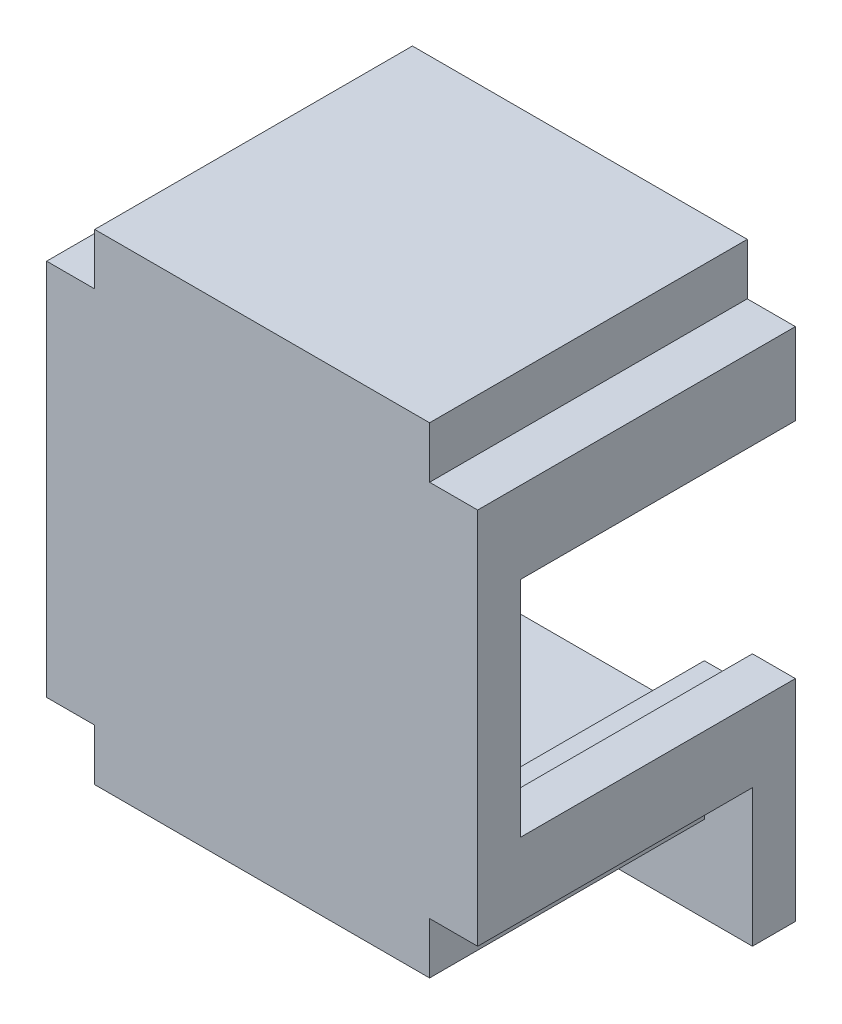
ISO-10303-21;
HEADER;
FILE_DESCRIPTION(('STEP AP214'),'2;1');
FILE_NAME('part.step','',(''),(''),'','','');
FILE_SCHEMA(('AUTOMOTIVE_DESIGN { 1 0 10303 214 1 1 1 1 }'));
ENDSEC;
DATA;
#1=APPLICATION_CONTEXT('core data for automotive mechanical design processes');
#2=APPLICATION_PROTOCOL_DEFINITION('international standard','automotive_design',2000,#1);
#3=PRODUCT_CONTEXT('',#1,'mechanical');
#4=PRODUCT('Part','Part','',(#3));
#5=PRODUCT_RELATED_PRODUCT_CATEGORY('part','',(#4));
#6=PRODUCT_DEFINITION_FORMATION('','',#4);
#7=PRODUCT_DEFINITION_CONTEXT('part definition',#1,'design');
#8=PRODUCT_DEFINITION('design','',#6,#7);
#9=PRODUCT_DEFINITION_SHAPE('','',#8);
#10=(LENGTH_UNIT() NAMED_UNIT(*) SI_UNIT(.MILLI.,.METRE.));
#11=(NAMED_UNIT(*) PLANE_ANGLE_UNIT() SI_UNIT($,.RADIAN.));
#12=(NAMED_UNIT(*) SI_UNIT($,.STERADIAN.) SOLID_ANGLE_UNIT());
#13=UNCERTAINTY_MEASURE_WITH_UNIT(LENGTH_MEASURE(1.E-05),#10,'distance_accuracy_value','');
#14=(GEOMETRIC_REPRESENTATION_CONTEXT(3) GLOBAL_UNCERTAINTY_ASSIGNED_CONTEXT((#13)) GLOBAL_UNIT_ASSIGNED_CONTEXT((#10,
#11,#12)) REPRESENTATION_CONTEXT('',''));
#15=CARTESIAN_POINT('',(0.,0.,0.));
#16=DIRECTION('',(0.,0.,1.));
#17=DIRECTION('',(1.,0.,0.));
#18=AXIS2_PLACEMENT_3D('',#15,#16,#17);
#19=CARTESIAN_POINT('',(0.,0.,32.));
#20=DIRECTION('',(0.,0.,1.));
#21=DIRECTION('',(1.,0.,0.));
#22=AXIS2_PLACEMENT_3D('',#19,#20,#21);
#23=PLANE('',#22);
#24=DIRECTION('',(-1.,0.,0.));
#25=VECTOR('',#24,1.);
#26=CARTESIAN_POINT('',(-10.353949142734,-76.2659169660727,32.));
#27=LINE('',#26,#25);
#28=CARTESIAN_POINT('',(-10.353949142734,-76.2659169660727,32.));
#29=VERTEX_POINT('',#28);
#30=CARTESIAN_POINT('',(-15.353949142734,-76.2659169660727,32.));
#31=VERTEX_POINT('',#30);
#32=EDGE_CURVE('E475',#29,#31,#27,.T.);
#33=ORIENTED_EDGE('',*,*,#32,.T.);
#34=DIRECTION('',(0.,-1.,0.));
#35=VECTOR('',#34,1.);
#36=CARTESIAN_POINT('',(-15.353949142734,-40.765916966074,32.));
#37=LINE('',#36,#35);
#38=CARTESIAN_POINT('',(-15.353949142734,-50.2659169660758,32.));
#39=VERTEX_POINT('',#38);
#40=EDGE_CURVE('E255',#39,#31,#37,.T.);
#41=ORIENTED_EDGE('',*,*,#40,.F.);
#42=DIRECTION('',(-1.,0.,0.));
#43=VECTOR('',#42,1.);
#44=CARTESIAN_POINT('',(-10.3539491427349,-50.2659169660758,32.));
#45=LINE('',#44,#43);
#46=CARTESIAN_POINT('',(-10.3539491427349,-50.2659169660758,32.));
#47=VERTEX_POINT('',#46);
#48=EDGE_CURVE('E282',#47,#39,#45,.T.);
#49=ORIENTED_EDGE('',*,*,#48,.F.);
#50=DIRECTION('',(-2.11250769963314E-13,-1.,0.));
#51=VECTOR('',#50,1.);
#52=CARTESIAN_POINT('',(-10.353949142734,-45.765916966074,32.));
#53=LINE('',#52,#51);
#54=CARTESIAN_POINT('',(-10.353949142734,-45.765916966074,32.));
#55=VERTEX_POINT('',#54);
#56=EDGE_CURVE('E279',#55,#47,#53,.T.);
#57=ORIENTED_EDGE('',*,*,#56,.F.);
#58=DIRECTION('',(-1.,0.,0.));
#59=VECTOR('',#58,1.);
#60=CARTESIAN_POINT('',(-4.753949142734,-45.765916966074,32.));
#61=LINE('',#60,#59);
#62=CARTESIAN_POINT('',(-4.753949142734,-45.765916966074,32.));
#63=VERTEX_POINT('',#62);
#64=EDGE_CURVE('E276',#63,#55,#61,.T.);
#65=ORIENTED_EDGE('',*,*,#64,.F.);
#66=DIRECTION('',(0.,-1.,0.));
#67=VECTOR('',#66,1.);
#68=CARTESIAN_POINT('',(-4.753949142734,-39.765916966074,32.));
#69=LINE('',#68,#67);
#70=CARTESIAN_POINT('',(-4.753949142734,-39.765916966074,32.));
#71=VERTEX_POINT('',#70);
#72=EDGE_CURVE('E51',#71,#63,#69,.T.);
#73=ORIENTED_EDGE('',*,*,#72,.F.);
#74=DIRECTION('',(-1.,0.,0.));
#75=VECTOR('',#74,1.);
#76=CARTESIAN_POINT('',(24.246050857266,-39.765916966074,32.));
#77=LINE('',#76,#75);
#78=CARTESIAN_POINT('',(24.246050857266,-39.765916966074,32.));
#79=VERTEX_POINT('',#78);
#80=EDGE_CURVE('E131',#79,#71,#77,.T.);
#81=ORIENTED_EDGE('',*,*,#80,.F.);
#82=DIRECTION('',(0.,1.,0.));
#83=VECTOR('',#82,1.);
#84=CARTESIAN_POINT('',(24.246050857266,-45.765916966074,32.));
#85=LINE('',#84,#83);
#86=CARTESIAN_POINT('',(24.246050857266,-45.765916966074,32.));
#87=VERTEX_POINT('',#86);
#88=EDGE_CURVE('E128',#87,#79,#85,.T.);
#89=ORIENTED_EDGE('',*,*,#88,.F.);
#90=DIRECTION('',(-1.,0.,0.));
#91=VECTOR('',#90,1.);
#92=CARTESIAN_POINT('',(29.8460508572678,-45.765916966074,32.));
#93=LINE('',#92,#91);
#94=CARTESIAN_POINT('',(29.8460508572678,-45.765916966074,32.));
#95=VERTEX_POINT('',#94);
#96=EDGE_CURVE('E169',#95,#87,#93,.T.);
#97=ORIENTED_EDGE('',*,*,#96,.F.);
#98=DIRECTION('',(0.,1.,0.));
#99=VECTOR('',#98,1.);
#100=CARTESIAN_POINT('',(29.8460508572678,-50.2659169660766,32.));
#101=LINE('',#100,#99);
#102=CARTESIAN_POINT('',(29.8460508572678,-50.2659169660766,32.));
#103=VERTEX_POINT('',#102);
#104=EDGE_CURVE('E110',#103,#95,#101,.T.);
#105=ORIENTED_EDGE('',*,*,#104,.F.);
#106=DIRECTION('',(1.,0.,0.));
#107=VECTOR('',#106,1.);
#108=CARTESIAN_POINT('',(29.8460508572678,-50.2659169660766,32.));
#109=LINE('',#108,#107);
#110=CARTESIAN_POINT('',(34.8460508572677,-50.2659169660766,32.));
#111=VERTEX_POINT('',#110);
#112=EDGE_CURVE('E175',#103,#111,#109,.T.);
#113=ORIENTED_EDGE('',*,*,#112,.T.);
#114=DIRECTION('',(0.,1.,0.));
#115=VECTOR('',#114,1.);
#116=CARTESIAN_POINT('',(34.8460508572673,-84.765916966074,32.));
#117=LINE('',#116,#115);
#118=CARTESIAN_POINT('',(34.8460508572673,-76.2659169660716,32.));
#119=VERTEX_POINT('',#118);
#120=EDGE_CURVE('E222',#119,#111,#117,.T.);
#121=ORIENTED_EDGE('',*,*,#120,.F.);
#122=DIRECTION('',(-1.,0.,0.));
#123=VECTOR('',#122,1.);
#124=CARTESIAN_POINT('',(34.8460508572673,-76.2659169660716,32.));
#125=LINE('',#124,#123);
#126=CARTESIAN_POINT('',(29.8460508572673,-76.2659169660716,32.));
#127=VERTEX_POINT('',#126);
#128=EDGE_CURVE('E477',#119,#127,#125,.T.);
#129=ORIENTED_EDGE('',*,*,#128,.T.);
#130=DIRECTION('',(0.,-1.,0.));
#131=VECTOR('',#130,1.);
#132=CARTESIAN_POINT('',(29.8460508572673,-76.2659169660716,32.));
#133=LINE('',#132,#131);
#134=CARTESIAN_POINT('',(29.8460508572673,-79.765916966074,32.));
#135=VERTEX_POINT('',#134);
#136=EDGE_CURVE('E479',#127,#135,#133,.T.);
#137=ORIENTED_EDGE('',*,*,#136,.T.);
#138=DIRECTION('',(-1.,0.,0.));
#139=VECTOR('',#138,1.);
#140=CARTESIAN_POINT('',(29.8460508572673,-79.765916966074,32.));
#141=LINE('',#140,#139);
#142=CARTESIAN_POINT('',(24.246050857266,-79.765916966074,32.));
#143=VERTEX_POINT('',#142);
#144=EDGE_CURVE('E482',#135,#143,#141,.T.);
#145=ORIENTED_EDGE('',*,*,#144,.T.);
#146=DIRECTION('',(0.,-1.,0.));
#147=VECTOR('',#146,1.);
#148=CARTESIAN_POINT('',(24.246050857266,-79.765916966074,32.));
#149=LINE('',#148,#147);
#150=CARTESIAN_POINT('',(24.246050857266,-85.765916966074,32.));
#151=VERTEX_POINT('',#150);
#152=EDGE_CURVE('E485',#143,#151,#149,.T.);
#153=ORIENTED_EDGE('',*,*,#152,.T.);
#154=DIRECTION('',(-1.,0.,0.));
#155=VECTOR('',#154,1.);
#156=CARTESIAN_POINT('',(24.246050857266,-85.765916966074,32.));
#157=LINE('',#156,#155);
#158=CARTESIAN_POINT('',(-4.753949142734,-85.765916966074,32.));
#159=VERTEX_POINT('',#158);
#160=EDGE_CURVE('E462',#151,#159,#157,.T.);
#161=ORIENTED_EDGE('',*,*,#160,.T.);
#162=DIRECTION('',(0.,1.,0.));
#163=VECTOR('',#162,1.);
#164=CARTESIAN_POINT('',(-4.753949142734,-85.765916966074,32.));
#165=LINE('',#164,#163);
#166=CARTESIAN_POINT('',(-4.753949142734,-79.765916966074,32.));
#167=VERTEX_POINT('',#166);
#168=EDGE_CURVE('E466',#159,#167,#165,.T.);
#169=ORIENTED_EDGE('',*,*,#168,.T.);
#170=DIRECTION('',(-1.,0.,0.));
#171=VECTOR('',#170,1.);
#172=CARTESIAN_POINT('',(-4.753949142734,-79.765916966074,32.));
#173=LINE('',#172,#171);
#174=CARTESIAN_POINT('',(-10.353949142734,-79.765916966074,32.));
#175=VERTEX_POINT('',#174);
#176=EDGE_CURVE('E469',#167,#175,#173,.T.);
#177=ORIENTED_EDGE('',*,*,#176,.T.);
#178=DIRECTION('',(0.,1.,0.));
#179=VECTOR('',#178,1.);
#180=CARTESIAN_POINT('',(-10.353949142734,-79.765916966074,32.));
#181=LINE('',#180,#179);
#182=EDGE_CURVE('E472',#175,#29,#181,.T.);
#183=ORIENTED_EDGE('',*,*,#182,.T.);
#184=EDGE_LOOP('',(#33,#41,#49,#57,#65,#73,#81,#89,#97,#105,#113,#121,#129,#137,#145,#153,#161,
#169,#177,#183));
#185=FACE_BOUND('',#184,.T.);
#186=ADVANCED_FACE('F33',(#185),#23,.F.);
#187=CARTESIAN_POINT('',(24.246050857266,-45.765916966074,32.));
#188=DIRECTION('',(-1.,0.,0.));
#189=DIRECTION('',(0.,0.,1.));
#190=AXIS2_PLACEMENT_3D('',#187,#188,#189);
#191=PLANE('',#190);
#192=DIRECTION('',(0.,1.,0.));
#193=VECTOR('',#192,1.);
#194=CARTESIAN_POINT('',(24.246050857266,-45.765916966074,0.));
#195=LINE('',#194,#193);
#196=CARTESIAN_POINT('',(24.246050857266,-45.765916966074,0.));
#197=VERTEX_POINT('',#196);
#198=CARTESIAN_POINT('',(24.246050857266,-39.765916966074,0.));
#199=VERTEX_POINT('',#198);
#200=EDGE_CURVE('E179',#197,#199,#195,.T.);
#201=ORIENTED_EDGE('',*,*,#200,.F.);
#202=DIRECTION('',(0.,0.,-1.));
#203=VECTOR('',#202,1.);
#204=CARTESIAN_POINT('',(24.246050857266,-45.765916966074,32.));
#205=LINE('',#204,#203);
#206=EDGE_CURVE('E11',#87,#197,#205,.T.);
#207=ORIENTED_EDGE('',*,*,#206,.F.);
#208=ORIENTED_EDGE('',*,*,#88,.T.);
#209=DIRECTION('',(0.,0.,-1.));
#210=VECTOR('',#209,1.);
#211=CARTESIAN_POINT('',(24.246050857266,-39.765916966074,32.));
#212=LINE('',#211,#210);
#213=EDGE_CURVE('E37',#79,#199,#212,.T.);
#214=ORIENTED_EDGE('',*,*,#213,.T.);
#215=EDGE_LOOP('',(#201,#207,#208,#214));
#216=FACE_BOUND('',#215,.T.);
#217=ADVANCED_FACE('F35',(#216),#191,.T.);
#218=CARTESIAN_POINT('',(29.8460508572678,-45.765916966074,32.));
#219=DIRECTION('',(0.,-1.,0.));
#220=DIRECTION('',(0.,0.,-1.));
#221=AXIS2_PLACEMENT_3D('',#218,#219,#220);
#222=PLANE('',#221);
#223=DIRECTION('',(-1.,0.,0.));
#224=VECTOR('',#223,1.);
#225=CARTESIAN_POINT('',(29.8460508572678,-45.765916966074,0.));
#226=LINE('',#225,#224);
#227=CARTESIAN_POINT('',(29.8460508572678,-45.765916966074,0.));
#228=VERTEX_POINT('',#227);
#229=EDGE_CURVE('E121',#228,#197,#226,.T.);
#230=ORIENTED_EDGE('',*,*,#229,.F.);
#231=DIRECTION('',(0.,0.,-1.));
#232=VECTOR('',#231,1.);
#233=CARTESIAN_POINT('',(29.8460508572678,-45.765916966074,32.));
#234=LINE('',#233,#232);
#235=EDGE_CURVE('E43',#95,#228,#234,.T.);
#236=ORIENTED_EDGE('',*,*,#235,.F.);
#237=ORIENTED_EDGE('',*,*,#96,.T.);
#238=ORIENTED_EDGE('',*,*,#206,.T.);
#239=EDGE_LOOP('',(#230,#236,#237,#238));
#240=FACE_BOUND('',#239,.T.);
#241=ADVANCED_FACE('F125',(#240),#222,.T.);
#242=CARTESIAN_POINT('',(29.8460508572678,-50.2659169660766,32.));
#243=DIRECTION('',(-1.,0.,0.));
#244=DIRECTION('',(0.,0.,1.));
#245=AXIS2_PLACEMENT_3D('',#242,#243,#244);
#246=PLANE('',#245);
#247=DIRECTION('',(0.,1.,0.));
#248=VECTOR('',#247,1.);
#249=CARTESIAN_POINT('',(29.8460508572678,-50.2659169660766,0.));
#250=LINE('',#249,#248);
#251=CARTESIAN_POINT('',(29.8460508572678,-50.2659169660766,0.));
#252=VERTEX_POINT('',#251);
#253=EDGE_CURVE('E107',#252,#228,#250,.T.);
#254=ORIENTED_EDGE('',*,*,#253,.F.);
#255=DIRECTION('',(0.,0.,-1.));
#256=VECTOR('',#255,1.);
#257=CARTESIAN_POINT('',(29.8460508572678,-50.2659169660766,32.));
#258=LINE('',#257,#256);
#259=EDGE_CURVE('E114',#103,#252,#258,.T.);
#260=ORIENTED_EDGE('',*,*,#259,.F.);
#261=ORIENTED_EDGE('',*,*,#104,.T.);
#262=ORIENTED_EDGE('',*,*,#235,.T.);
#263=EDGE_LOOP('',(#254,#260,#261,#262));
#264=FACE_BOUND('',#263,.T.);
#265=ADVANCED_FACE('F105',(#264),#246,.T.);
#266=CARTESIAN_POINT('',(29.8460508572678,-50.2659169660766,32.));
#267=DIRECTION('',(0.,1.,0.));
#268=DIRECTION('',(0.,0.,1.));
#269=AXIS2_PLACEMENT_3D('',#266,#267,#268);
#270=PLANE('',#269);
#271=DIRECTION('',(1.,0.,0.));
#272=VECTOR('',#271,1.);
#273=CARTESIAN_POINT('',(29.8460508572678,-50.2659169660766,0.));
#274=LINE('',#273,#272);
#275=CARTESIAN_POINT('',(34.8460508572678,-50.2659169660766,0.));
#276=VERTEX_POINT('',#275);
#277=EDGE_CURVE('E123',#252,#276,#274,.T.);
#278=ORIENTED_EDGE('',*,*,#277,.T.);
#279=DIRECTION('',(0.,0.,-1.));
#280=VECTOR('',#279,1.);
#281=CARTESIAN_POINT('',(34.8460508572678,-50.2659169660766,32.));
#282=LINE('',#281,#280);
#283=EDGE_CURVE('E136',#111,#276,#282,.T.);
#284=ORIENTED_EDGE('',*,*,#283,.F.);
#285=ORIENTED_EDGE('',*,*,#112,.F.);
#286=ORIENTED_EDGE('',*,*,#259,.T.);
#287=EDGE_LOOP('',(#278,#284,#285,#286));
#288=FACE_BOUND('',#287,.T.);
#289=ADVANCED_FACE('F213',(#288),#270,.F.);
#290=CARTESIAN_POINT('',(34.8460508572678,-50.2659169660766,32.));
#291=DIRECTION('',(-1.,0.,0.));
#292=DIRECTION('',(0.,0.,1.));
#293=AXIS2_PLACEMENT_3D('',#290,#291,#292);
#294=PLANE('',#293);
#295=DIRECTION('',(0.,1.,0.));
#296=VECTOR('',#295,1.);
#297=CARTESIAN_POINT('',(34.8460508572678,-50.2659169660766,0.));
#298=LINE('',#297,#296);
#299=CARTESIAN_POINT('',(34.8460508572678,-40.765916966074,0.));
#300=VERTEX_POINT('',#299);
#301=EDGE_CURVE('E210',#276,#300,#298,.T.);
#302=ORIENTED_EDGE('',*,*,#301,.T.);
#303=DIRECTION('',(0.,0.,-1.));
#304=VECTOR('',#303,1.);
#305=CARTESIAN_POINT('',(34.8460508572678,-40.765916966074,32.));
#306=LINE('',#305,#304);
#307=CARTESIAN_POINT('',(34.8460508572678,-40.765916966074,37.));
#308=VERTEX_POINT('',#307);
#309=EDGE_CURVE('E139',#308,#300,#306,.T.);
#310=ORIENTED_EDGE('',*,*,#309,.F.);
#311=DIRECTION('',(0.,1.,0.));
#312=VECTOR('',#311,1.);
#313=CARTESIAN_POINT('',(34.8460508572673,-84.765916966074,37.));
#314=LINE('',#313,#312);
#315=CARTESIAN_POINT('',(34.8460508572673,-84.765916966074,37.));
#316=VERTEX_POINT('',#315);
#317=EDGE_CURVE('E251',#316,#308,#314,.T.);
#318=ORIENTED_EDGE('',*,*,#317,.F.);
#319=DIRECTION('',(0.,0.,-1.));
#320=VECTOR('',#319,1.);
#321=CARTESIAN_POINT('',(34.8460508572673,-84.765916966074,37.));
#322=LINE('',#321,#320);
#323=CARTESIAN_POINT('',(34.8460508572673,-84.765916966074,5.));
#324=VERTEX_POINT('',#323);
#325=EDGE_CURVE('E245',#316,#324,#322,.T.);
#326=ORIENTED_EDGE('',*,*,#325,.T.);
#327=DIRECTION('',(0.,-1.,0.));
#328=VECTOR('',#327,1.);
#329=CARTESIAN_POINT('',(34.8460508572673,-84.765916966074,5.));
#330=LINE('',#329,#328);
#331=CARTESIAN_POINT('',(34.8460508572673,-100.765916966074,5.));
#332=VERTEX_POINT('',#331);
#333=EDGE_CURVE('E423',#324,#332,#330,.T.);
#334=ORIENTED_EDGE('',*,*,#333,.T.);
#335=DIRECTION('',(0.,0.,-1.));
#336=VECTOR('',#335,1.);
#337=CARTESIAN_POINT('',(34.8460508572673,-100.765916966074,5.));
#338=LINE('',#337,#336);
#339=CARTESIAN_POINT('',(34.8460508572673,-100.765916966074,0.));
#340=VERTEX_POINT('',#339);
#341=EDGE_CURVE('E540',#332,#340,#338,.T.);
#342=ORIENTED_EDGE('',*,*,#341,.T.);
#343=DIRECTION('',(0.,-1.,0.));
#344=VECTOR('',#343,1.);
#345=CARTESIAN_POINT('',(34.8460508572673,-76.2659169660716,0.));
#346=LINE('',#345,#344);
#347=CARTESIAN_POINT('',(34.8460508572673,-76.2659169660716,0.));
#348=VERTEX_POINT('',#347);
#349=EDGE_CURVE('E503',#348,#340,#346,.T.);
#350=ORIENTED_EDGE('',*,*,#349,.F.);
#351=DIRECTION('',(0.,0.,-1.));
#352=VECTOR('',#351,1.);
#353=CARTESIAN_POINT('',(34.8460508572673,-76.2659169660716,32.));
#354=LINE('',#353,#352);
#355=EDGE_CURVE('E523',#119,#348,#354,.T.);
#356=ORIENTED_EDGE('',*,*,#355,.F.);
#357=ORIENTED_EDGE('',*,*,#120,.T.);
#358=ORIENTED_EDGE('',*,*,#283,.T.);
#359=EDGE_LOOP('',(#302,#310,#318,#326,#334,#342,#350,#356,#357,#358));
#360=FACE_BOUND('',#359,.T.);
#361=ADVANCED_FACE('F218',(#360),#294,.F.);
#362=CARTESIAN_POINT('',(34.8460508572678,-40.765916966074,32.));
#363=DIRECTION('',(0.,-1.,0.));
#364=DIRECTION('',(0.,0.,-1.));
#365=AXIS2_PLACEMENT_3D('',#362,#363,#364);
#366=PLANE('',#365);
#367=DIRECTION('',(-1.,0.,0.));
#368=VECTOR('',#367,1.);
#369=CARTESIAN_POINT('',(34.8460508572678,-40.765916966074,0.));
#370=LINE('',#369,#368);
#371=CARTESIAN_POINT('',(29.246050857266,-40.765916966074,0.));
#372=VERTEX_POINT('',#371);
#373=EDGE_CURVE('E208',#300,#372,#370,.T.);
#374=ORIENTED_EDGE('',*,*,#373,.T.);
#375=DIRECTION('',(0.,0.,-1.));
#376=VECTOR('',#375,1.);
#377=CARTESIAN_POINT('',(29.246050857266,-40.765916966074,32.));
#378=LINE('',#377,#376);
#379=CARTESIAN_POINT('',(29.246050857266,-40.765916966074,37.));
#380=VERTEX_POINT('',#379);
#381=EDGE_CURVE('E142',#380,#372,#378,.T.);
#382=ORIENTED_EDGE('',*,*,#381,.F.);
#383=DIRECTION('',(-1.,0.,0.));
#384=VECTOR('',#383,1.);
#385=CARTESIAN_POINT('',(34.8460508572678,-40.765916966074,37.));
#386=LINE('',#385,#384);
#387=EDGE_CURVE('E246',#308,#380,#386,.T.);
#388=ORIENTED_EDGE('',*,*,#387,.F.);
#389=ORIENTED_EDGE('',*,*,#309,.T.);
#390=EDGE_LOOP('',(#374,#382,#388,#389));
#391=FACE_BOUND('',#390,.T.);
#392=ADVANCED_FACE('F229',(#391),#366,.F.);
#393=CARTESIAN_POINT('',(29.246050857266,-40.765916966074,32.));
#394=DIRECTION('',(-1.,0.,0.));
#395=DIRECTION('',(0.,0.,1.));
#396=AXIS2_PLACEMENT_3D('',#393,#394,#395);
#397=PLANE('',#396);
#398=DIRECTION('',(0.,1.,0.));
#399=VECTOR('',#398,1.);
#400=CARTESIAN_POINT('',(29.246050857266,-40.765916966074,0.));
#401=LINE('',#400,#399);
#402=CARTESIAN_POINT('',(29.246050857266,-34.765916966074,0.));
#403=VERTEX_POINT('',#402);
#404=EDGE_CURVE('E206',#372,#403,#401,.T.);
#405=ORIENTED_EDGE('',*,*,#404,.T.);
#406=DIRECTION('',(0.,0.,-1.));
#407=VECTOR('',#406,1.);
#408=CARTESIAN_POINT('',(29.246050857266,-34.765916966074,32.));
#409=LINE('',#408,#407);
#410=CARTESIAN_POINT('',(29.246050857266,-34.765916966074,37.));
#411=VERTEX_POINT('',#410);
#412=EDGE_CURVE('E145',#411,#403,#409,.T.);
#413=ORIENTED_EDGE('',*,*,#412,.F.);
#414=DIRECTION('',(0.,1.,0.));
#415=VECTOR('',#414,1.);
#416=CARTESIAN_POINT('',(29.246050857266,-40.765916966074,37.));
#417=LINE('',#416,#415);
#418=EDGE_CURVE('E238',#380,#411,#417,.T.);
#419=ORIENTED_EDGE('',*,*,#418,.F.);
#420=ORIENTED_EDGE('',*,*,#381,.T.);
#421=EDGE_LOOP('',(#405,#413,#419,#420));
#422=FACE_BOUND('',#421,.T.);
#423=ADVANCED_FACE('F235',(#422),#397,.F.);
#424=CARTESIAN_POINT('',(29.246050857266,-34.765916966074,32.));
#425=DIRECTION('',(0.,-1.,0.));
#426=DIRECTION('',(0.,0.,-1.));
#427=AXIS2_PLACEMENT_3D('',#424,#425,#426);
#428=PLANE('',#427);
#429=DIRECTION('',(-1.,0.,0.));
#430=VECTOR('',#429,1.);
#431=CARTESIAN_POINT('',(29.246050857266,-34.765916966074,0.));
#432=LINE('',#431,#430);
#433=CARTESIAN_POINT('',(-9.753949142734,-34.765916966074,0.));
#434=VERTEX_POINT('',#433);
#435=EDGE_CURVE('E204',#403,#434,#432,.T.);
#436=ORIENTED_EDGE('',*,*,#435,.T.);
#437=DIRECTION('',(0.,0.,-1.));
#438=VECTOR('',#437,1.);
#439=CARTESIAN_POINT('',(-9.753949142734,-34.765916966074,32.));
#440=LINE('',#439,#438);
#441=CARTESIAN_POINT('',(-9.753949142734,-34.765916966074,37.));
#442=VERTEX_POINT('',#441);
#443=EDGE_CURVE('E148',#442,#434,#440,.T.);
#444=ORIENTED_EDGE('',*,*,#443,.F.);
#445=DIRECTION('',(-1.,0.,0.));
#446=VECTOR('',#445,1.);
#447=CARTESIAN_POINT('',(29.246050857266,-34.765916966074,37.));
#448=LINE('',#447,#446);
#449=EDGE_CURVE('E259',#411,#442,#448,.T.);
#450=ORIENTED_EDGE('',*,*,#449,.F.);
#451=ORIENTED_EDGE('',*,*,#412,.T.);
#452=EDGE_LOOP('',(#436,#444,#450,#451));
#453=FACE_BOUND('',#452,.T.);
#454=ADVANCED_FACE('F632',(#453),#428,.F.);
#455=CARTESIAN_POINT('',(-9.753949142734,-34.765916966074,32.));
#456=DIRECTION('',(1.,0.,0.));
#457=DIRECTION('',(0.,0.,-1.));
#458=AXIS2_PLACEMENT_3D('',#455,#456,#457);
#459=PLANE('',#458);
#460=DIRECTION('',(0.,-1.,0.));
#461=VECTOR('',#460,1.);
#462=CARTESIAN_POINT('',(-9.753949142734,-34.765916966074,0.));
#463=LINE('',#462,#461);
#464=CARTESIAN_POINT('',(-9.753949142734,-40.765916966074,0.));
#465=VERTEX_POINT('',#464);
#466=EDGE_CURVE('E202',#434,#465,#463,.T.);
#467=ORIENTED_EDGE('',*,*,#466,.T.);
#468=DIRECTION('',(0.,0.,-1.));
#469=VECTOR('',#468,1.);
#470=CARTESIAN_POINT('',(-9.753949142734,-40.765916966074,32.));
#471=LINE('',#470,#469);
#472=CARTESIAN_POINT('',(-9.753949142734,-40.765916966074,37.));
#473=VERTEX_POINT('',#472);
#474=EDGE_CURVE('E151',#473,#465,#471,.T.);
#475=ORIENTED_EDGE('',*,*,#474,.F.);
#476=DIRECTION('',(0.,-1.,0.));
#477=VECTOR('',#476,1.);
#478=CARTESIAN_POINT('',(-9.753949142734,-34.765916966074,37.));
#479=LINE('',#478,#477);
#480=EDGE_CURVE('E458',#442,#473,#479,.T.);
#481=ORIENTED_EDGE('',*,*,#480,.F.);
#482=ORIENTED_EDGE('',*,*,#443,.T.);
#483=EDGE_LOOP('',(#467,#475,#481,#482));
#484=FACE_BOUND('',#483,.T.);
#485=ADVANCED_FACE('F630',(#484),#459,.F.);
#486=CARTESIAN_POINT('',(-9.753949142734,-40.765916966074,32.));
#487=DIRECTION('',(0.,-1.,0.));
#488=DIRECTION('',(0.,0.,-1.));
#489=AXIS2_PLACEMENT_3D('',#486,#487,#488);
#490=PLANE('',#489);
#491=DIRECTION('',(-1.,0.,0.));
#492=VECTOR('',#491,1.);
#493=CARTESIAN_POINT('',(-9.753949142734,-40.765916966074,0.));
#494=LINE('',#493,#492);
#495=CARTESIAN_POINT('',(-15.353949142734,-40.765916966074,0.));
#496=VERTEX_POINT('',#495);
#497=EDGE_CURVE('E200',#465,#496,#494,.T.);
#498=ORIENTED_EDGE('',*,*,#497,.T.);
#499=DIRECTION('',(0.,0.,-1.));
#500=VECTOR('',#499,1.);
#501=CARTESIAN_POINT('',(-15.353949142734,-40.765916966074,32.));
#502=LINE('',#501,#500);
#503=CARTESIAN_POINT('',(-15.353949142734,-40.765916966074,37.));
#504=VERTEX_POINT('',#503);
#505=EDGE_CURVE('E154',#504,#496,#502,.T.);
#506=ORIENTED_EDGE('',*,*,#505,.F.);
#507=DIRECTION('',(-1.,0.,0.));
#508=VECTOR('',#507,1.);
#509=CARTESIAN_POINT('',(-9.753949142734,-40.765916966074,37.));
#510=LINE('',#509,#508);
#511=EDGE_CURVE('E455',#473,#504,#510,.T.);
#512=ORIENTED_EDGE('',*,*,#511,.F.);
#513=ORIENTED_EDGE('',*,*,#474,.T.);
#514=EDGE_LOOP('',(#498,#506,#512,#513));
#515=FACE_BOUND('',#514,.T.);
#516=ADVANCED_FACE('F621',(#515),#490,.F.);
#517=CARTESIAN_POINT('',(-15.353949142734,-40.765916966074,32.));
#518=DIRECTION('',(1.,0.,0.));
#519=DIRECTION('',(0.,0.,-1.));
#520=AXIS2_PLACEMENT_3D('',#517,#518,#519);
#521=PLANE('',#520);
#522=DIRECTION('',(0.,-1.,0.));
#523=VECTOR('',#522,1.);
#524=CARTESIAN_POINT('',(-15.353949142734,-40.765916966074,0.));
#525=LINE('',#524,#523);
#526=CARTESIAN_POINT('',(-15.353949142734,-50.2659169660758,0.));
#527=VERTEX_POINT('',#526);
#528=EDGE_CURVE('E197',#496,#527,#525,.T.);
#529=ORIENTED_EDGE('',*,*,#528,.T.);
#530=DIRECTION('',(0.,0.,-1.));
#531=VECTOR('',#530,1.);
#532=CARTESIAN_POINT('',(-15.353949142734,-50.2659169660758,32.));
#533=LINE('',#532,#531);
#534=EDGE_CURVE('E157',#39,#527,#533,.T.);
#535=ORIENTED_EDGE('',*,*,#534,.F.);
#536=ORIENTED_EDGE('',*,*,#40,.T.);
#537=DIRECTION('',(0.,0.,-1.));
#538=VECTOR('',#537,1.);
#539=CARTESIAN_POINT('',(-15.353949142734,-76.2659169660727,32.));
#540=LINE('',#539,#538);
#541=CARTESIAN_POINT('',(-15.353949142734,-76.2659169660727,0.));
#542=VERTEX_POINT('',#541);
#543=EDGE_CURVE('E525',#31,#542,#540,.T.);
#544=ORIENTED_EDGE('',*,*,#543,.T.);
#545=DIRECTION('',(0.,1.,0.));
#546=VECTOR('',#545,1.);
#547=CARTESIAN_POINT('',(-15.353949142734,-84.765916966074,0.));
#548=LINE('',#547,#546);
#549=CARTESIAN_POINT('',(-15.353949142734,-100.765916966074,0.));
#550=VERTEX_POINT('',#549);
#551=EDGE_CURVE('E500',#550,#542,#548,.T.);
#552=ORIENTED_EDGE('',*,*,#551,.F.);
#553=DIRECTION('',(0.,0.,-1.));
#554=VECTOR('',#553,1.);
#555=CARTESIAN_POINT('',(-15.353949142734,-100.765916966074,5.));
#556=LINE('',#555,#554);
#557=CARTESIAN_POINT('',(-15.353949142734,-100.765916966074,5.));
#558=VERTEX_POINT('',#557);
#559=EDGE_CURVE('E539',#558,#550,#556,.T.);
#560=ORIENTED_EDGE('',*,*,#559,.F.);
#561=DIRECTION('',(0.,1.,0.));
#562=VECTOR('',#561,1.);
#563=CARTESIAN_POINT('',(-15.353949142734,-84.765916966074,5.));
#564=LINE('',#563,#562);
#565=CARTESIAN_POINT('',(-15.353949142734,-84.765916966074,5.));
#566=VERTEX_POINT('',#565);
#567=EDGE_CURVE('E557',#558,#566,#564,.T.);
#568=ORIENTED_EDGE('',*,*,#567,.T.);
#569=DIRECTION('',(0.,0.,-1.));
#570=VECTOR('',#569,1.);
#571=CARTESIAN_POINT('',(-15.353949142734,-84.765916966074,37.));
#572=LINE('',#571,#570);
#573=CARTESIAN_POINT('',(-15.353949142734,-84.765916966074,37.));
#574=VERTEX_POINT('',#573);
#575=EDGE_CURVE('E182',#574,#566,#572,.T.);
#576=ORIENTED_EDGE('',*,*,#575,.F.);
#577=DIRECTION('',(0.,-1.,0.));
#578=VECTOR('',#577,1.);
#579=CARTESIAN_POINT('',(-15.353949142734,-40.765916966074,37.));
#580=LINE('',#579,#578);
#581=EDGE_CURVE('E453',#504,#574,#580,.T.);
#582=ORIENTED_EDGE('',*,*,#581,.F.);
#583=ORIENTED_EDGE('',*,*,#505,.T.);
#584=EDGE_LOOP('',(#529,#535,#536,#544,#552,#560,#568,#576,#582,#583));
#585=FACE_BOUND('',#584,.T.);
#586=ADVANCED_FACE('F601',(#585),#521,.F.);
#587=CARTESIAN_POINT('',(-10.3539491427349,-50.2659169660758,32.));
#588=DIRECTION('',(0.,-1.,0.));
#589=DIRECTION('',(0.,0.,-1.));
#590=AXIS2_PLACEMENT_3D('',#587,#588,#589);
#591=PLANE('',#590);
#592=DIRECTION('',(-1.,0.,0.));
#593=VECTOR('',#592,1.);
#594=CARTESIAN_POINT('',(-10.3539491427349,-50.2659169660758,0.));
#595=LINE('',#594,#593);
#596=CARTESIAN_POINT('',(-10.3539491427349,-50.2659169660758,0.));
#597=VERTEX_POINT('',#596);
#598=EDGE_CURVE('E194',#597,#527,#595,.T.);
#599=ORIENTED_EDGE('',*,*,#598,.F.);
#600=DIRECTION('',(0.,0.,-1.));
#601=VECTOR('',#600,1.);
#602=CARTESIAN_POINT('',(-10.3539491427349,-50.2659169660758,32.));
#603=LINE('',#602,#601);
#604=EDGE_CURVE('E159',#47,#597,#603,.T.);
#605=ORIENTED_EDGE('',*,*,#604,.F.);
#606=ORIENTED_EDGE('',*,*,#48,.T.);
#607=ORIENTED_EDGE('',*,*,#534,.T.);
#608=EDGE_LOOP('',(#599,#605,#606,#607));
#609=FACE_BOUND('',#608,.T.);
#610=ADVANCED_FACE('F606',(#609),#591,.T.);
#611=CARTESIAN_POINT('',(-10.353949142734,-45.765916966074,32.));
#612=DIRECTION('',(1.,-2.11250769963314E-13,0.));
#613=DIRECTION('',(2.11250769963314E-13,1.,0.));
#614=AXIS2_PLACEMENT_3D('',#611,#612,#613);
#615=PLANE('',#614);
#616=DIRECTION('',(-2.11250769963314E-13,-1.,0.));
#617=VECTOR('',#616,1.);
#618=CARTESIAN_POINT('',(-10.353949142734,-45.765916966074,0.));
#619=LINE('',#618,#617);
#620=CARTESIAN_POINT('',(-10.353949142734,-45.765916966074,0.));
#621=VERTEX_POINT('',#620);
#622=EDGE_CURVE('E191',#621,#597,#619,.T.);
#623=ORIENTED_EDGE('',*,*,#622,.F.);
#624=DIRECTION('',(0.,0.,-1.));
#625=VECTOR('',#624,1.);
#626=CARTESIAN_POINT('',(-10.353949142734,-45.765916966074,32.));
#627=LINE('',#626,#625);
#628=EDGE_CURVE('E161',#55,#621,#627,.T.);
#629=ORIENTED_EDGE('',*,*,#628,.F.);
#630=ORIENTED_EDGE('',*,*,#56,.T.);
#631=ORIENTED_EDGE('',*,*,#604,.T.);
#632=EDGE_LOOP('',(#623,#629,#630,#631));
#633=FACE_BOUND('',#632,.T.);
#634=ADVANCED_FACE('F611',(#633),#615,.T.);
#635=CARTESIAN_POINT('',(-4.753949142734,-45.765916966074,32.));
#636=DIRECTION('',(0.,-1.,0.));
#637=DIRECTION('',(0.,0.,-1.));
#638=AXIS2_PLACEMENT_3D('',#635,#636,#637);
#639=PLANE('',#638);
#640=DIRECTION('',(-1.,0.,0.));
#641=VECTOR('',#640,1.);
#642=CARTESIAN_POINT('',(-4.753949142734,-45.765916966074,0.));
#643=LINE('',#642,#641);
#644=CARTESIAN_POINT('',(-4.753949142734,-45.765916966074,0.));
#645=VERTEX_POINT('',#644);
#646=EDGE_CURVE('E188',#645,#621,#643,.T.);
#647=ORIENTED_EDGE('',*,*,#646,.F.);
#648=DIRECTION('',(0.,0.,-1.));
#649=VECTOR('',#648,1.);
#650=CARTESIAN_POINT('',(-4.753949142734,-45.765916966074,32.));
#651=LINE('',#650,#649);
#652=EDGE_CURVE('E163',#63,#645,#651,.T.);
#653=ORIENTED_EDGE('',*,*,#652,.F.);
#654=ORIENTED_EDGE('',*,*,#64,.T.);
#655=ORIENTED_EDGE('',*,*,#628,.T.);
#656=EDGE_LOOP('',(#647,#653,#654,#655));
#657=FACE_BOUND('',#656,.T.);
#658=ADVANCED_FACE('F614',(#657),#639,.T.);
#659=CARTESIAN_POINT('',(-4.753949142734,-39.765916966074,32.));
#660=DIRECTION('',(1.,0.,0.));
#661=DIRECTION('',(0.,1.,0.));
#662=AXIS2_PLACEMENT_3D('',#659,#660,#661);
#663=PLANE('',#662);
#664=DIRECTION('',(0.,-1.,0.));
#665=VECTOR('',#664,1.);
#666=CARTESIAN_POINT('',(-4.753949142734,-39.765916966074,0.));
#667=LINE('',#666,#665);
#668=CARTESIAN_POINT('',(-4.753949142734,-39.765916966074,0.));
#669=VERTEX_POINT('',#668);
#670=EDGE_CURVE('E185',#669,#645,#667,.T.);
#671=ORIENTED_EDGE('',*,*,#670,.F.);
#672=DIRECTION('',(0.,0.,-1.));
#673=VECTOR('',#672,1.);
#674=CARTESIAN_POINT('',(-4.753949142734,-39.765916966074,32.));
#675=LINE('',#674,#673);
#676=EDGE_CURVE('E164',#71,#669,#675,.T.);
#677=ORIENTED_EDGE('',*,*,#676,.F.);
#678=ORIENTED_EDGE('',*,*,#72,.T.);
#679=ORIENTED_EDGE('',*,*,#652,.T.);
#680=EDGE_LOOP('',(#671,#677,#678,#679));
#681=FACE_BOUND('',#680,.T.);
#682=ADVANCED_FACE('F616',(#681),#663,.T.);
#683=CARTESIAN_POINT('',(24.246050857266,-39.765916966074,32.));
#684=DIRECTION('',(0.,-1.,0.));
#685=DIRECTION('',(0.,0.,-1.));
#686=AXIS2_PLACEMENT_3D('',#683,#684,#685);
#687=PLANE('',#686);
#688=DIRECTION('',(-1.,0.,0.));
#689=VECTOR('',#688,1.);
#690=CARTESIAN_POINT('',(24.246050857266,-39.765916966074,0.));
#691=LINE('',#690,#689);
#692=EDGE_CURVE('E181',#199,#669,#691,.T.);
#693=ORIENTED_EDGE('',*,*,#692,.F.);
#694=ORIENTED_EDGE('',*,*,#213,.F.);
#695=ORIENTED_EDGE('',*,*,#80,.T.);
#696=ORIENTED_EDGE('',*,*,#676,.T.);
#697=EDGE_LOOP('',(#693,#694,#695,#696));
#698=FACE_BOUND('',#697,.T.);
#699=ADVANCED_FACE('F617',(#698),#687,.T.);
#700=CARTESIAN_POINT('',(0.,0.,0.));
#701=DIRECTION('',(0.,0.,1.));
#702=DIRECTION('',(1.,0.,0.));
#703=AXIS2_PLACEMENT_3D('',#700,#701,#702);
#704=PLANE('',#703);
#705=ORIENTED_EDGE('',*,*,#200,.T.);
#706=ORIENTED_EDGE('',*,*,#692,.T.);
#707=ORIENTED_EDGE('',*,*,#670,.T.);
#708=ORIENTED_EDGE('',*,*,#646,.T.);
#709=ORIENTED_EDGE('',*,*,#622,.T.);
#710=ORIENTED_EDGE('',*,*,#598,.T.);
#711=ORIENTED_EDGE('',*,*,#528,.F.);
#712=ORIENTED_EDGE('',*,*,#497,.F.);
#713=ORIENTED_EDGE('',*,*,#466,.F.);
#714=ORIENTED_EDGE('',*,*,#435,.F.);
#715=ORIENTED_EDGE('',*,*,#404,.F.);
#716=ORIENTED_EDGE('',*,*,#373,.F.);
#717=ORIENTED_EDGE('',*,*,#301,.F.);
#718=ORIENTED_EDGE('',*,*,#277,.F.);
#719=ORIENTED_EDGE('',*,*,#253,.T.);
#720=ORIENTED_EDGE('',*,*,#229,.T.);
#721=EDGE_LOOP('',(#705,#706,#707,#708,#709,#710,#711,#712,#713,#714,#715,#716,#717,#718,#719,#720));
#722=FACE_BOUND('',#721,.T.);
#723=ADVANCED_FACE('F120',(#722),#704,.F.);
#724=CARTESIAN_POINT('',(-15.353949142734,-84.765916966074,37.));
#725=DIRECTION('',(0.,1.,0.));
#726=DIRECTION('',(0.,0.,1.));
#727=AXIS2_PLACEMENT_3D('',#724,#725,#726);
#728=PLANE('',#727);
#729=ORIENTED_EDGE('',*,*,#575,.T.);
#730=DIRECTION('',(1.,0.,0.));
#731=VECTOR('',#730,1.);
#732=CARTESIAN_POINT('',(-9.753949142734,-84.765916966074,5.));
#733=LINE('',#732,#731);
#734=CARTESIAN_POINT('',(-9.753949142734,-84.765916966074,5.));
#735=VERTEX_POINT('',#734);
#736=EDGE_CURVE('E554',#566,#735,#733,.T.);
#737=ORIENTED_EDGE('',*,*,#736,.T.);
#738=DIRECTION('',(0.,0.,-1.));
#739=VECTOR('',#738,1.);
#740=CARTESIAN_POINT('',(-9.753949142734,-84.765916966074,37.));
#741=LINE('',#740,#739);
#742=CARTESIAN_POINT('',(-9.753949142734,-84.765916966074,37.));
#743=VERTEX_POINT('',#742);
#744=EDGE_CURVE('E269',#743,#735,#741,.T.);
#745=ORIENTED_EDGE('',*,*,#744,.F.);
#746=DIRECTION('',(1.,0.,0.));
#747=VECTOR('',#746,1.);
#748=CARTESIAN_POINT('',(-15.353949142734,-84.765916966074,37.));
#749=LINE('',#748,#747);
#750=EDGE_CURVE('E451',#574,#743,#749,.T.);
#751=ORIENTED_EDGE('',*,*,#750,.F.);
#752=EDGE_LOOP('',(#729,#737,#745,#751));
#753=FACE_BOUND('',#752,.T.);
#754=ADVANCED_FACE('F662',(#753),#728,.F.);
#755=CARTESIAN_POINT('',(-9.753949142734,-84.765916966074,37.));
#756=DIRECTION('',(1.,0.,0.));
#757=DIRECTION('',(0.,0.,-1.));
#758=AXIS2_PLACEMENT_3D('',#755,#756,#757);
#759=PLANE('',#758);
#760=ORIENTED_EDGE('',*,*,#744,.T.);
#761=DIRECTION('',(0.,-1.,0.));
#762=VECTOR('',#761,1.);
#763=CARTESIAN_POINT('',(-9.753949142734,-90.765916966074,5.));
#764=LINE('',#763,#762);
#765=CARTESIAN_POINT('',(-9.753949142734,-90.765916966074,5.));
#766=VERTEX_POINT('',#765);
#767=EDGE_CURVE('E551',#735,#766,#764,.T.);
#768=ORIENTED_EDGE('',*,*,#767,.T.);
#769=DIRECTION('',(0.,0.,-1.));
#770=VECTOR('',#769,1.);
#771=CARTESIAN_POINT('',(-9.753949142734,-90.765916966074,37.));
#772=LINE('',#771,#770);
#773=CARTESIAN_POINT('',(-9.753949142734,-90.765916966074,37.));
#774=VERTEX_POINT('',#773);
#775=EDGE_CURVE('E266',#774,#766,#772,.T.);
#776=ORIENTED_EDGE('',*,*,#775,.F.);
#777=DIRECTION('',(0.,-1.,0.));
#778=VECTOR('',#777,1.);
#779=CARTESIAN_POINT('',(-9.753949142734,-84.765916966074,37.));
#780=LINE('',#779,#778);
#781=EDGE_CURVE('E449',#743,#774,#780,.T.);
#782=ORIENTED_EDGE('',*,*,#781,.F.);
#783=EDGE_LOOP('',(#760,#768,#776,#782));
#784=FACE_BOUND('',#783,.T.);
#785=ADVANCED_FACE('F658',(#784),#759,.F.);
#786=CARTESIAN_POINT('',(-9.753949142734,-90.765916966074,37.));
#787=DIRECTION('',(0.,1.,0.));
#788=DIRECTION('',(0.,0.,1.));
#789=AXIS2_PLACEMENT_3D('',#786,#787,#788);
#790=PLANE('',#789);
#791=ORIENTED_EDGE('',*,*,#775,.T.);
#792=DIRECTION('',(1.,0.,0.));
#793=VECTOR('',#792,1.);
#794=CARTESIAN_POINT('',(29.246050857266,-90.765916966074,5.));
#795=LINE('',#794,#793);
#796=CARTESIAN_POINT('',(29.246050857266,-90.765916966074,5.));
#797=VERTEX_POINT('',#796);
#798=EDGE_CURVE('E548',#766,#797,#795,.T.);
#799=ORIENTED_EDGE('',*,*,#798,.T.);
#800=DIRECTION('',(0.,0.,-1.));
#801=VECTOR('',#800,1.);
#802=CARTESIAN_POINT('',(29.246050857266,-90.765916966074,37.));
#803=LINE('',#802,#801);
#804=CARTESIAN_POINT('',(29.246050857266,-90.765916966074,37.));
#805=VERTEX_POINT('',#804);
#806=EDGE_CURVE('E263',#805,#797,#803,.T.);
#807=ORIENTED_EDGE('',*,*,#806,.F.);
#808=DIRECTION('',(1.,0.,0.));
#809=VECTOR('',#808,1.);
#810=CARTESIAN_POINT('',(-9.753949142734,-90.765916966074,37.));
#811=LINE('',#810,#809);
#812=EDGE_CURVE('E447',#774,#805,#811,.T.);
#813=ORIENTED_EDGE('',*,*,#812,.F.);
#814=EDGE_LOOP('',(#791,#799,#807,#813));
#815=FACE_BOUND('',#814,.T.);
#816=ADVANCED_FACE('F654',(#815),#790,.F.);
#817=CARTESIAN_POINT('',(29.246050857266,-90.765916966074,37.));
#818=DIRECTION('',(-1.,0.,0.));
#819=DIRECTION('',(0.,0.,1.));
#820=AXIS2_PLACEMENT_3D('',#817,#818,#819);
#821=PLANE('',#820);
#822=ORIENTED_EDGE('',*,*,#806,.T.);
#823=DIRECTION('',(0.,1.,0.));
#824=VECTOR('',#823,1.);
#825=CARTESIAN_POINT('',(29.246050857266,-84.765916966074,5.));
#826=LINE('',#825,#824);
#827=CARTESIAN_POINT('',(29.246050857266,-84.765916966074,5.));
#828=VERTEX_POINT('',#827);
#829=EDGE_CURVE('E542',#797,#828,#826,.T.);
#830=ORIENTED_EDGE('',*,*,#829,.T.);
#831=DIRECTION('',(0.,0.,-1.));
#832=VECTOR('',#831,1.);
#833=CARTESIAN_POINT('',(29.246050857266,-84.765916966074,37.));
#834=LINE('',#833,#832);
#835=CARTESIAN_POINT('',(29.246050857266,-84.765916966074,37.));
#836=VERTEX_POINT('',#835);
#837=EDGE_CURVE('E249',#836,#828,#834,.T.);
#838=ORIENTED_EDGE('',*,*,#837,.F.);
#839=DIRECTION('',(0.,1.,0.));
#840=VECTOR('',#839,1.);
#841=CARTESIAN_POINT('',(29.246050857266,-90.765916966074,37.));
#842=LINE('',#841,#840);
#843=EDGE_CURVE('E443',#805,#836,#842,.T.);
#844=ORIENTED_EDGE('',*,*,#843,.F.);
#845=EDGE_LOOP('',(#822,#830,#838,#844));
#846=FACE_BOUND('',#845,.T.);
#847=ADVANCED_FACE('F651',(#846),#821,.F.);
#848=CARTESIAN_POINT('',(29.246050857266,-84.765916966074,37.));
#849=DIRECTION('',(0.,1.,0.));
#850=DIRECTION('',(0.,0.,1.));
#851=AXIS2_PLACEMENT_3D('',#848,#849,#850);
#852=PLANE('',#851);
#853=ORIENTED_EDGE('',*,*,#837,.T.);
#854=DIRECTION('',(1.,0.,0.));
#855=VECTOR('',#854,1.);
#856=CARTESIAN_POINT('',(34.8460508572673,-84.765916966074,5.));
#857=LINE('',#856,#855);
#858=EDGE_CURVE('E426',#828,#324,#857,.T.);
#859=ORIENTED_EDGE('',*,*,#858,.T.);
#860=ORIENTED_EDGE('',*,*,#325,.F.);
#861=DIRECTION('',(1.,0.,0.));
#862=VECTOR('',#861,1.);
#863=CARTESIAN_POINT('',(29.246050857266,-84.765916966074,37.));
#864=LINE('',#863,#862);
#865=EDGE_CURVE('E442',#836,#316,#864,.T.);
#866=ORIENTED_EDGE('',*,*,#865,.F.);
#867=EDGE_LOOP('',(#853,#859,#860,#866));
#868=FACE_BOUND('',#867,.T.);
#869=ADVANCED_FACE('F435',(#868),#852,.F.);
#870=CARTESIAN_POINT('',(0.,0.,37.));
#871=DIRECTION('',(0.,0.,1.));
#872=DIRECTION('',(1.,0.,0.));
#873=AXIS2_PLACEMENT_3D('',#870,#871,#872);
#874=PLANE('',#873);
#875=ORIENTED_EDGE('',*,*,#449,.T.);
#876=ORIENTED_EDGE('',*,*,#480,.T.);
#877=ORIENTED_EDGE('',*,*,#511,.T.);
#878=ORIENTED_EDGE('',*,*,#581,.T.);
#879=ORIENTED_EDGE('',*,*,#750,.T.);
#880=ORIENTED_EDGE('',*,*,#781,.T.);
#881=ORIENTED_EDGE('',*,*,#812,.T.);
#882=ORIENTED_EDGE('',*,*,#843,.T.);
#883=ORIENTED_EDGE('',*,*,#865,.T.);
#884=ORIENTED_EDGE('',*,*,#317,.T.);
#885=ORIENTED_EDGE('',*,*,#387,.T.);
#886=ORIENTED_EDGE('',*,*,#418,.T.);
#887=EDGE_LOOP('',(#875,#876,#877,#878,#879,#880,#881,#882,#883,#884,#885,#886));
#888=FACE_BOUND('',#887,.T.);
#889=ADVANCED_FACE('F626',(#888),#874,.T.);
#890=CARTESIAN_POINT('',(24.246050857266,-85.765916966074,32.));
#891=DIRECTION('',(0.,-1.,0.));
#892=DIRECTION('',(0.,0.,-1.));
#893=AXIS2_PLACEMENT_3D('',#890,#891,#892);
#894=PLANE('',#893);
#895=DIRECTION('',(-1.,0.,0.));
#896=VECTOR('',#895,1.);
#897=CARTESIAN_POINT('',(24.246050857266,-85.765916966074,0.));
#898=LINE('',#897,#896);
#899=CARTESIAN_POINT('',(24.246050857266,-85.765916966074,0.));
#900=VERTEX_POINT('',#899);
#901=CARTESIAN_POINT('',(-4.753949142734,-85.765916966074,0.));
#902=VERTEX_POINT('',#901);
#903=EDGE_CURVE('E258',#900,#902,#898,.T.);
#904=ORIENTED_EDGE('',*,*,#903,.T.);
#905=DIRECTION('',(0.,0.,-1.));
#906=VECTOR('',#905,1.);
#907=CARTESIAN_POINT('',(-4.753949142734,-85.765916966074,32.));
#908=LINE('',#907,#906);
#909=EDGE_CURVE('E536',#159,#902,#908,.T.);
#910=ORIENTED_EDGE('',*,*,#909,.F.);
#911=ORIENTED_EDGE('',*,*,#160,.F.);
#912=DIRECTION('',(0.,0.,-1.));
#913=VECTOR('',#912,1.);
#914=CARTESIAN_POINT('',(24.246050857266,-85.765916966074,32.));
#915=LINE('',#914,#913);
#916=EDGE_CURVE('E488',#151,#900,#915,.T.);
#917=ORIENTED_EDGE('',*,*,#916,.T.);
#918=EDGE_LOOP('',(#904,#910,#911,#917));
#919=FACE_BOUND('',#918,.T.);
#920=ADVANCED_FACE('F586',(#919),#894,.F.);
#921=CARTESIAN_POINT('',(-4.753949142734,-85.765916966074,32.));
#922=DIRECTION('',(-1.,0.,0.));
#923=DIRECTION('',(0.,-1.,0.));
#924=AXIS2_PLACEMENT_3D('',#921,#922,#923);
#925=PLANE('',#924);
#926=DIRECTION('',(0.,1.,0.));
#927=VECTOR('',#926,1.);
#928=CARTESIAN_POINT('',(-4.753949142734,-85.765916966074,0.));
#929=LINE('',#928,#927);
#930=CARTESIAN_POINT('',(-4.753949142734,-79.765916966074,0.));
#931=VERTEX_POINT('',#930);
#932=EDGE_CURVE('E491',#902,#931,#929,.T.);
#933=ORIENTED_EDGE('',*,*,#932,.T.);
#934=DIRECTION('',(0.,0.,-1.));
#935=VECTOR('',#934,1.);
#936=CARTESIAN_POINT('',(-4.753949142734,-79.765916966074,32.));
#937=LINE('',#936,#935);
#938=EDGE_CURVE('E533',#167,#931,#937,.T.);
#939=ORIENTED_EDGE('',*,*,#938,.F.);
#940=ORIENTED_EDGE('',*,*,#168,.F.);
#941=ORIENTED_EDGE('',*,*,#909,.T.);
#942=EDGE_LOOP('',(#933,#939,#940,#941));
#943=FACE_BOUND('',#942,.T.);
#944=ADVANCED_FACE('F589',(#943),#925,.F.);
#945=CARTESIAN_POINT('',(-4.753949142734,-79.765916966074,32.));
#946=DIRECTION('',(0.,-1.,0.));
#947=DIRECTION('',(0.,0.,-1.));
#948=AXIS2_PLACEMENT_3D('',#945,#946,#947);
#949=PLANE('',#948);
#950=DIRECTION('',(-1.,0.,0.));
#951=VECTOR('',#950,1.);
#952=CARTESIAN_POINT('',(-4.753949142734,-79.765916966074,0.));
#953=LINE('',#952,#951);
#954=CARTESIAN_POINT('',(-10.353949142734,-79.765916966074,0.));
#955=VERTEX_POINT('',#954);
#956=EDGE_CURVE('E493',#931,#955,#953,.T.);
#957=ORIENTED_EDGE('',*,*,#956,.T.);
#958=DIRECTION('',(0.,0.,-1.));
#959=VECTOR('',#958,1.);
#960=CARTESIAN_POINT('',(-10.353949142734,-79.765916966074,32.));
#961=LINE('',#960,#959);
#962=EDGE_CURVE('E530',#175,#955,#961,.T.);
#963=ORIENTED_EDGE('',*,*,#962,.F.);
#964=ORIENTED_EDGE('',*,*,#176,.F.);
#965=ORIENTED_EDGE('',*,*,#938,.T.);
#966=EDGE_LOOP('',(#957,#963,#964,#965));
#967=FACE_BOUND('',#966,.T.);
#968=ADVANCED_FACE('F592',(#967),#949,.F.);
#969=CARTESIAN_POINT('',(-10.353949142734,-79.765916966074,32.));
#970=DIRECTION('',(-1.,0.,0.));
#971=DIRECTION('',(0.,0.,1.));
#972=AXIS2_PLACEMENT_3D('',#969,#970,#971);
#973=PLANE('',#972);
#974=DIRECTION('',(0.,1.,0.));
#975=VECTOR('',#974,1.);
#976=CARTESIAN_POINT('',(-10.353949142734,-79.765916966074,0.));
#977=LINE('',#976,#975);
#978=CARTESIAN_POINT('',(-10.353949142734,-76.2659169660727,0.));
#979=VERTEX_POINT('',#978);
#980=EDGE_CURVE('E495',#955,#979,#977,.T.);
#981=ORIENTED_EDGE('',*,*,#980,.T.);
#982=DIRECTION('',(0.,0.,-1.));
#983=VECTOR('',#982,1.);
#984=CARTESIAN_POINT('',(-10.353949142734,-76.2659169660727,32.));
#985=LINE('',#984,#983);
#986=EDGE_CURVE('E527',#29,#979,#985,.T.);
#987=ORIENTED_EDGE('',*,*,#986,.F.);
#988=ORIENTED_EDGE('',*,*,#182,.F.);
#989=ORIENTED_EDGE('',*,*,#962,.T.);
#990=EDGE_LOOP('',(#981,#987,#988,#989));
#991=FACE_BOUND('',#990,.T.);
#992=ADVANCED_FACE('F596',(#991),#973,.F.);
#993=CARTESIAN_POINT('',(-10.353949142734,-76.2659169660727,32.));
#994=DIRECTION('',(0.,-1.,0.));
#995=DIRECTION('',(0.,0.,-1.));
#996=AXIS2_PLACEMENT_3D('',#993,#994,#995);
#997=PLANE('',#996);
#998=DIRECTION('',(-1.,0.,0.));
#999=VECTOR('',#998,1.);
#1000=CARTESIAN_POINT('',(-10.353949142734,-76.2659169660727,0.));
#1001=LINE('',#1000,#999);
#1002=EDGE_CURVE('E497',#979,#542,#1001,.T.);
#1003=ORIENTED_EDGE('',*,*,#1002,.T.);
#1004=ORIENTED_EDGE('',*,*,#543,.F.);
#1005=ORIENTED_EDGE('',*,*,#32,.F.);
#1006=ORIENTED_EDGE('',*,*,#986,.T.);
#1007=EDGE_LOOP('',(#1003,#1004,#1005,#1006));
#1008=FACE_BOUND('',#1007,.T.);
#1009=ADVANCED_FACE('F794',(#1008),#997,.F.);
#1010=CARTESIAN_POINT('',(34.8460508572673,-76.2659169660716,32.));
#1011=DIRECTION('',(0.,-1.,0.));
#1012=DIRECTION('',(0.,0.,-1.));
#1013=AXIS2_PLACEMENT_3D('',#1010,#1011,#1012);
#1014=PLANE('',#1013);
#1015=DIRECTION('',(-1.,0.,0.));
#1016=VECTOR('',#1015,1.);
#1017=CARTESIAN_POINT('',(34.8460508572673,-76.2659169660716,0.));
#1018=LINE('',#1017,#1016);
#1019=CARTESIAN_POINT('',(29.8460508572673,-76.2659169660716,0.));
#1020=VERTEX_POINT('',#1019);
#1021=EDGE_CURVE('E505',#348,#1020,#1018,.T.);
#1022=ORIENTED_EDGE('',*,*,#1021,.T.);
#1023=DIRECTION('',(0.,0.,-1.));
#1024=VECTOR('',#1023,1.);
#1025=CARTESIAN_POINT('',(29.8460508572673,-76.2659169660716,32.));
#1026=LINE('',#1025,#1024);
#1027=EDGE_CURVE('E520',#127,#1020,#1026,.T.);
#1028=ORIENTED_EDGE('',*,*,#1027,.F.);
#1029=ORIENTED_EDGE('',*,*,#128,.F.);
#1030=ORIENTED_EDGE('',*,*,#355,.T.);
#1031=EDGE_LOOP('',(#1022,#1028,#1029,#1030));
#1032=FACE_BOUND('',#1031,.T.);
#1033=ADVANCED_FACE('F572',(#1032),#1014,.F.);
#1034=CARTESIAN_POINT('',(29.8460508572673,-76.2659169660716,32.));
#1035=DIRECTION('',(1.,0.,0.));
#1036=DIRECTION('',(0.,0.,-1.));
#1037=AXIS2_PLACEMENT_3D('',#1034,#1035,#1036);
#1038=PLANE('',#1037);
#1039=DIRECTION('',(0.,-1.,0.));
#1040=VECTOR('',#1039,1.);
#1041=CARTESIAN_POINT('',(29.8460508572673,-76.2659169660716,0.));
#1042=LINE('',#1041,#1040);
#1043=CARTESIAN_POINT('',(29.8460508572673,-79.765916966074,0.));
#1044=VERTEX_POINT('',#1043);
#1045=EDGE_CURVE('E507',#1020,#1044,#1042,.T.);
#1046=ORIENTED_EDGE('',*,*,#1045,.T.);
#1047=DIRECTION('',(0.,0.,-1.));
#1048=VECTOR('',#1047,1.);
#1049=CARTESIAN_POINT('',(29.8460508572673,-79.765916966074,32.));
#1050=LINE('',#1049,#1048);
#1051=EDGE_CURVE('E517',#135,#1044,#1050,.T.);
#1052=ORIENTED_EDGE('',*,*,#1051,.F.);
#1053=ORIENTED_EDGE('',*,*,#136,.F.);
#1054=ORIENTED_EDGE('',*,*,#1027,.T.);
#1055=EDGE_LOOP('',(#1046,#1052,#1053,#1054));
#1056=FACE_BOUND('',#1055,.T.);
#1057=ADVANCED_FACE('F575',(#1056),#1038,.F.);
#1058=CARTESIAN_POINT('',(29.8460508572673,-79.765916966074,32.));
#1059=DIRECTION('',(0.,-1.,0.));
#1060=DIRECTION('',(0.,0.,-1.));
#1061=AXIS2_PLACEMENT_3D('',#1058,#1059,#1060);
#1062=PLANE('',#1061);
#1063=DIRECTION('',(-1.,0.,0.));
#1064=VECTOR('',#1063,1.);
#1065=CARTESIAN_POINT('',(29.8460508572673,-79.765916966074,0.));
#1066=LINE('',#1065,#1064);
#1067=CARTESIAN_POINT('',(24.246050857266,-79.765916966074,0.));
#1068=VERTEX_POINT('',#1067);
#1069=EDGE_CURVE('E509',#1044,#1068,#1066,.T.);
#1070=ORIENTED_EDGE('',*,*,#1069,.T.);
#1071=DIRECTION('',(0.,0.,-1.));
#1072=VECTOR('',#1071,1.);
#1073=CARTESIAN_POINT('',(24.246050857266,-79.765916966074,32.));
#1074=LINE('',#1073,#1072);
#1075=EDGE_CURVE('E514',#143,#1068,#1074,.T.);
#1076=ORIENTED_EDGE('',*,*,#1075,.F.);
#1077=ORIENTED_EDGE('',*,*,#144,.F.);
#1078=ORIENTED_EDGE('',*,*,#1051,.T.);
#1079=EDGE_LOOP('',(#1070,#1076,#1077,#1078));
#1080=FACE_BOUND('',#1079,.T.);
#1081=ADVANCED_FACE('F579',(#1080),#1062,.F.);
#1082=CARTESIAN_POINT('',(24.246050857266,-79.765916966074,32.));
#1083=DIRECTION('',(1.,0.,0.));
#1084=DIRECTION('',(0.,0.,-1.));
#1085=AXIS2_PLACEMENT_3D('',#1082,#1083,#1084);
#1086=PLANE('',#1085);
#1087=DIRECTION('',(0.,-1.,0.));
#1088=VECTOR('',#1087,1.);
#1089=CARTESIAN_POINT('',(24.246050857266,-79.765916966074,0.));
#1090=LINE('',#1089,#1088);
#1091=EDGE_CURVE('E465',#1068,#900,#1090,.T.);
#1092=ORIENTED_EDGE('',*,*,#1091,.T.);
#1093=ORIENTED_EDGE('',*,*,#916,.F.);
#1094=ORIENTED_EDGE('',*,*,#152,.F.);
#1095=ORIENTED_EDGE('',*,*,#1075,.T.);
#1096=EDGE_LOOP('',(#1092,#1093,#1094,#1095));
#1097=FACE_BOUND('',#1096,.T.);
#1098=ADVANCED_FACE('F582',(#1097),#1086,.F.);
#1099=CARTESIAN_POINT('',(0.,0.,0.));
#1100=DIRECTION('',(0.,0.,-1.));
#1101=DIRECTION('',(-1.,0.,0.));
#1102=AXIS2_PLACEMENT_3D('',#1099,#1100,#1101);
#1103=PLANE('',#1102);
#1104=ORIENTED_EDGE('',*,*,#903,.F.);
#1105=ORIENTED_EDGE('',*,*,#1091,.F.);
#1106=ORIENTED_EDGE('',*,*,#1069,.F.);
#1107=ORIENTED_EDGE('',*,*,#1045,.F.);
#1108=ORIENTED_EDGE('',*,*,#1021,.F.);
#1109=ORIENTED_EDGE('',*,*,#349,.T.);
#1110=DIRECTION('',(-1.,0.,0.));
#1111=VECTOR('',#1110,1.);
#1112=CARTESIAN_POINT('',(34.8460508572673,-100.765916966074,0.));
#1113=LINE('',#1112,#1111);
#1114=EDGE_CURVE('E439',#340,#550,#1113,.T.);
#1115=ORIENTED_EDGE('',*,*,#1114,.T.);
#1116=ORIENTED_EDGE('',*,*,#551,.T.);
#1117=ORIENTED_EDGE('',*,*,#1002,.F.);
#1118=ORIENTED_EDGE('',*,*,#980,.F.);
#1119=ORIENTED_EDGE('',*,*,#956,.F.);
#1120=ORIENTED_EDGE('',*,*,#932,.F.);
#1121=EDGE_LOOP('',(#1104,#1105,#1106,#1107,#1108,#1109,#1115,#1116,#1117,#1118,#1119,#1120));
#1122=FACE_BOUND('',#1121,.T.);
#1123=ADVANCED_FACE('F568',(#1122),#1103,.T.);
#1124=CARTESIAN_POINT('',(34.8460508572673,-100.765916966074,5.));
#1125=DIRECTION('',(0.,-1.,0.));
#1126=DIRECTION('',(0.,0.,-1.));
#1127=AXIS2_PLACEMENT_3D('',#1124,#1125,#1126);
#1128=PLANE('',#1127);
#1129=ORIENTED_EDGE('',*,*,#1114,.F.);
#1130=ORIENTED_EDGE('',*,*,#341,.F.);
#1131=DIRECTION('',(-1.,0.,0.));
#1132=VECTOR('',#1131,1.);
#1133=CARTESIAN_POINT('',(34.8460508572673,-100.765916966074,5.));
#1134=LINE('',#1133,#1132);
#1135=EDGE_CURVE('E430',#332,#558,#1134,.T.);
#1136=ORIENTED_EDGE('',*,*,#1135,.T.);
#1137=ORIENTED_EDGE('',*,*,#559,.T.);
#1138=EDGE_LOOP('',(#1129,#1130,#1136,#1137));
#1139=FACE_BOUND('',#1138,.T.);
#1140=ADVANCED_FACE('F562',(#1139),#1128,.T.);
#1141=CARTESIAN_POINT('',(0.,0.,5.));
#1142=DIRECTION('',(0.,0.,1.));
#1143=DIRECTION('',(1.,0.,0.));
#1144=AXIS2_PLACEMENT_3D('',#1141,#1142,#1143);
#1145=PLANE('',#1144);
#1146=ORIENTED_EDGE('',*,*,#858,.F.);
#1147=ORIENTED_EDGE('',*,*,#829,.F.);
#1148=ORIENTED_EDGE('',*,*,#798,.F.);
#1149=ORIENTED_EDGE('',*,*,#767,.F.);
#1150=ORIENTED_EDGE('',*,*,#736,.F.);
#1151=ORIENTED_EDGE('',*,*,#567,.F.);
#1152=ORIENTED_EDGE('',*,*,#1135,.F.);
#1153=ORIENTED_EDGE('',*,*,#333,.F.);
#1154=EDGE_LOOP('',(#1146,#1147,#1148,#1149,#1150,#1151,#1152,#1153));
#1155=FACE_BOUND('',#1154,.T.);
#1156=ADVANCED_FACE('F425',(#1155),#1145,.T.);
#1157=CLOSED_SHELL('',(#186,#217,#241,#265,#289,#361,#392,#423,#454,#485,#516,#586,#610,#634,
#658,#682,#699,#723,#754,#785,#816,#847,#869,#889,#920,#944,#968,#992,#1009,#1033,#1057,#1081,
#1098,#1123,#1140,#1156));
#1158=MANIFOLD_SOLID_BREP('B2',#1157);
#1159=ADVANCED_BREP_SHAPE_REPRESENTATION('',(#18,#1158),#14);
#1160=SHAPE_DEFINITION_REPRESENTATION(#9,#1159);
ENDSEC;
END-ISO-10303-21;
